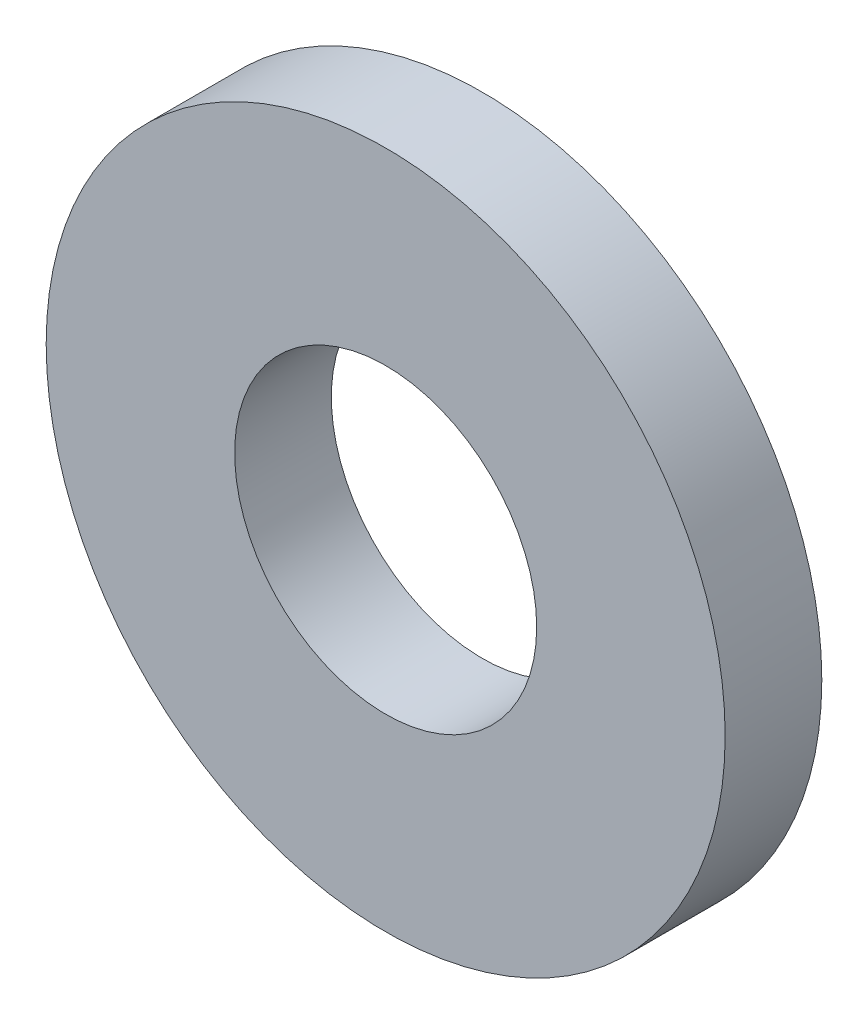
ISO-10303-21;
HEADER;
FILE_DESCRIPTION(('STEP AP214'),'2;1');
FILE_NAME('part.step','',(''),(''),'','','');
FILE_SCHEMA(('AUTOMOTIVE_DESIGN { 1 0 10303 214 1 1 1 1 }'));
ENDSEC;
DATA;
#1=APPLICATION_CONTEXT('core data for automotive mechanical design processes');
#2=APPLICATION_PROTOCOL_DEFINITION('international standard','automotive_design',2000,#1);
#3=PRODUCT_CONTEXT('',#1,'mechanical');
#4=PRODUCT('Part','Part','',(#3));
#5=PRODUCT_RELATED_PRODUCT_CATEGORY('part','',(#4));
#6=PRODUCT_DEFINITION_FORMATION('','',#4);
#7=PRODUCT_DEFINITION_CONTEXT('part definition',#1,'design');
#8=PRODUCT_DEFINITION('design','',#6,#7);
#9=PRODUCT_DEFINITION_SHAPE('','',#8);
#10=(LENGTH_UNIT() NAMED_UNIT(*) SI_UNIT(.MILLI.,.METRE.));
#11=(NAMED_UNIT(*) PLANE_ANGLE_UNIT() SI_UNIT($,.RADIAN.));
#12=(NAMED_UNIT(*) SI_UNIT($,.STERADIAN.) SOLID_ANGLE_UNIT());
#13=UNCERTAINTY_MEASURE_WITH_UNIT(LENGTH_MEASURE(1.E-05),#10,'distance_accuracy_value','');
#14=(GEOMETRIC_REPRESENTATION_CONTEXT(3) GLOBAL_UNCERTAINTY_ASSIGNED_CONTEXT((#13)) GLOBAL_UNIT_ASSIGNED_CONTEXT((#10,
#11,#12)) REPRESENTATION_CONTEXT('',''));
#15=CARTESIAN_POINT('',(0.,0.,0.));
#16=DIRECTION('',(0.,0.,1.));
#17=DIRECTION('',(1.,0.,0.));
#18=AXIS2_PLACEMENT_3D('',#15,#16,#17);
#19=CARTESIAN_POINT('',(0.,0.,-2.032));
#20=DIRECTION('',(0.,0.,1.));
#21=DIRECTION('',(1.,0.,0.));
#22=AXIS2_PLACEMENT_3D('',#19,#20,#21);
#23=CYLINDRICAL_SURFACE('',#22,7.1374);
#24=CARTESIAN_POINT('',(0.,0.,-2.032));
#25=DIRECTION('',(0.,0.,1.));
#26=DIRECTION('',(1.,0.,0.));
#27=AXIS2_PLACEMENT_3D('',#24,#25,#26);
#28=CIRCLE('',#27,7.1374);
#29=CARTESIAN_POINT('',(7.1374,0.,-2.032));
#30=VERTEX_POINT('',#29);
#31=EDGE_CURVE('E10',#30,#30,#28,.T.);
#32=ORIENTED_EDGE('',*,*,#31,.T.);
#33=EDGE_LOOP('',(#32));
#34=FACE_BOUND('',#33,.T.);
#35=CARTESIAN_POINT('',(0.,0.,0.));
#36=DIRECTION('',(0.,0.,1.));
#37=DIRECTION('',(1.,0.,0.));
#38=AXIS2_PLACEMENT_3D('',#35,#36,#37);
#39=CIRCLE('',#38,7.1374);
#40=CARTESIAN_POINT('',(7.1374,0.,0.));
#41=VERTEX_POINT('',#40);
#42=EDGE_CURVE('E46',#41,#41,#39,.T.);
#43=ORIENTED_EDGE('',*,*,#42,.F.);
#44=EDGE_LOOP('',(#43));
#45=FACE_BOUND('',#44,.T.);
#46=ADVANCED_FACE('F32',(#34,#45),#23,.T.);
#47=CARTESIAN_POINT('',(7.1374,0.,-2.032));
#48=DIRECTION('',(0.,0.,-1.));
#49=DIRECTION('',(-1.,0.,0.));
#50=AXIS2_PLACEMENT_3D('',#47,#48,#49);
#51=PLANE('',#50);
#52=CARTESIAN_POINT('',(0.,0.,-2.032));
#53=DIRECTION('',(0.,0.,1.));
#54=DIRECTION('',(1.,0.,0.));
#55=AXIS2_PLACEMENT_3D('',#52,#53,#54);
#56=CIRCLE('',#55,3.175);
#57=CARTESIAN_POINT('',(3.175,0.,-2.032));
#58=VERTEX_POINT('',#57);
#59=EDGE_CURVE('E38',#58,#58,#56,.T.);
#60=ORIENTED_EDGE('',*,*,#59,.T.);
#61=EDGE_LOOP('',(#60));
#62=FACE_BOUND('',#61,.T.);
#63=ORIENTED_EDGE('',*,*,#31,.F.);
#64=EDGE_LOOP('',(#63));
#65=FACE_BOUND('',#64,.T.);
#66=ADVANCED_FACE('F56',(#62,#65),#51,.T.);
#67=CARTESIAN_POINT('',(0.,0.,-2.032));
#68=DIRECTION('',(0.,0.,1.));
#69=DIRECTION('',(1.,0.,0.));
#70=AXIS2_PLACEMENT_3D('',#67,#68,#69);
#71=CYLINDRICAL_SURFACE('',#70,3.175);
#72=CARTESIAN_POINT('',(0.,0.,0.));
#73=DIRECTION('',(0.,0.,1.));
#74=DIRECTION('',(1.,0.,0.));
#75=AXIS2_PLACEMENT_3D('',#72,#73,#74);
#76=CIRCLE('',#75,3.175);
#77=CARTESIAN_POINT('',(3.175,0.,0.));
#78=VERTEX_POINT('',#77);
#79=EDGE_CURVE('E42',#78,#78,#76,.T.);
#80=ORIENTED_EDGE('',*,*,#79,.T.);
#81=EDGE_LOOP('',(#80));
#82=FACE_BOUND('',#81,.T.);
#83=ORIENTED_EDGE('',*,*,#59,.F.);
#84=EDGE_LOOP('',(#83));
#85=FACE_BOUND('',#84,.T.);
#86=ADVANCED_FACE('F60',(#82,#85),#71,.F.);
#87=CARTESIAN_POINT('',(3.175,0.,0.));
#88=DIRECTION('',(0.,0.,1.));
#89=DIRECTION('',(1.,0.,0.));
#90=AXIS2_PLACEMENT_3D('',#87,#88,#89);
#91=PLANE('',#90);
#92=ORIENTED_EDGE('',*,*,#42,.T.);
#93=EDGE_LOOP('',(#92));
#94=FACE_BOUND('',#93,.T.);
#95=ORIENTED_EDGE('',*,*,#79,.F.);
#96=EDGE_LOOP('',(#95));
#97=FACE_BOUND('',#96,.T.);
#98=ADVANCED_FACE('F52',(#94,#97),#91,.T.);
#99=CLOSED_SHELL('',(#46,#66,#86,#98));
#100=MANIFOLD_SOLID_BREP('B2',#99);
#101=ADVANCED_BREP_SHAPE_REPRESENTATION('',(#18,#100),#14);
#102=SHAPE_DEFINITION_REPRESENTATION(#9,#101);
ENDSEC;
END-ISO-10303-21;
